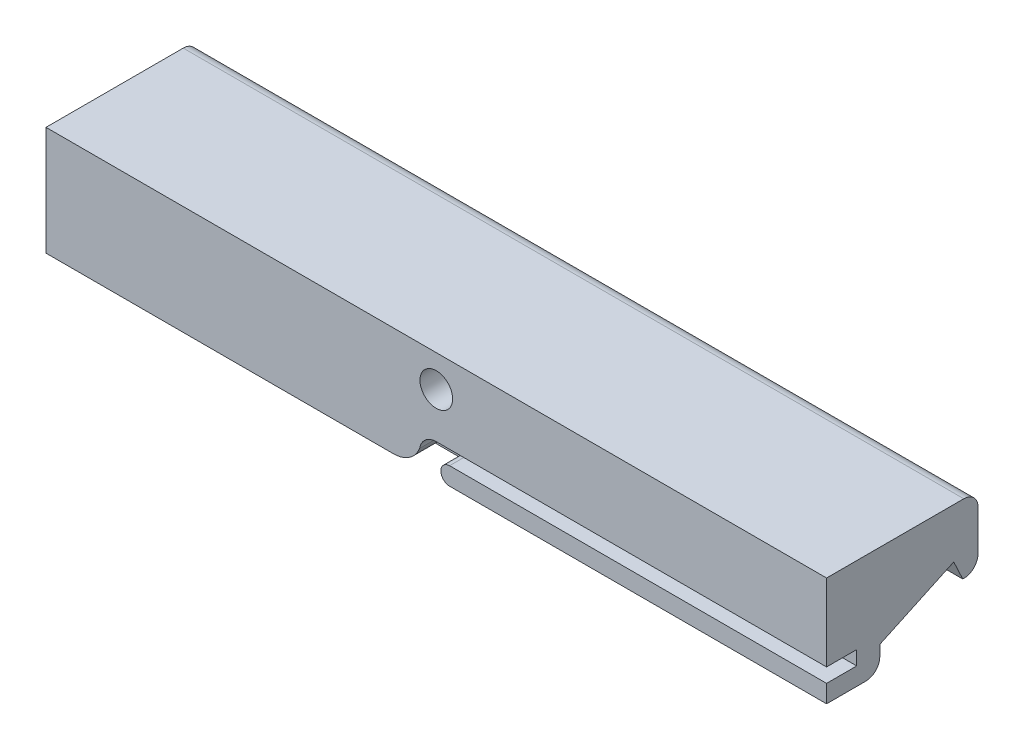
ISO-10303-21;
HEADER;
FILE_DESCRIPTION(('STEP AP214'),'2;1');
FILE_NAME('part.step','',(''),(''),'','','');
FILE_SCHEMA(('AUTOMOTIVE_DESIGN { 1 0 10303 214 1 1 1 1 }'));
ENDSEC;
DATA;
#1=APPLICATION_CONTEXT('core data for automotive mechanical design processes');
#2=APPLICATION_PROTOCOL_DEFINITION('international standard','automotive_design',2000,#1);
#3=PRODUCT_CONTEXT('',#1,'mechanical');
#4=PRODUCT('Part','Part','',(#3));
#5=PRODUCT_RELATED_PRODUCT_CATEGORY('part','',(#4));
#6=PRODUCT_DEFINITION_FORMATION('','',#4);
#7=PRODUCT_DEFINITION_CONTEXT('part definition',#1,'design');
#8=PRODUCT_DEFINITION('design','',#6,#7);
#9=PRODUCT_DEFINITION_SHAPE('','',#8);
#10=(LENGTH_UNIT() NAMED_UNIT(*) SI_UNIT(.MILLI.,.METRE.));
#11=(NAMED_UNIT(*) PLANE_ANGLE_UNIT() SI_UNIT($,.RADIAN.));
#12=(NAMED_UNIT(*) SI_UNIT($,.STERADIAN.) SOLID_ANGLE_UNIT());
#13=UNCERTAINTY_MEASURE_WITH_UNIT(LENGTH_MEASURE(1.E-05),#10,'distance_accuracy_value','');
#14=(GEOMETRIC_REPRESENTATION_CONTEXT(3) GLOBAL_UNCERTAINTY_ASSIGNED_CONTEXT((#13)) GLOBAL_UNIT_ASSIGNED_CONTEXT((#10,
#11,#12)) REPRESENTATION_CONTEXT('',''));
#15=CARTESIAN_POINT('',(0.,0.,0.));
#16=DIRECTION('',(0.,0.,1.));
#17=DIRECTION('',(1.,0.,0.));
#18=AXIS2_PLACEMENT_3D('',#15,#16,#17);
#19=CARTESIAN_POINT('',(110.,15.360110010018,0.));
#20=DIRECTION('',(0.,0.,-1.));
#21=DIRECTION('',(0.,1.,0.));
#22=AXIS2_PLACEMENT_3D('',#19,#20,#21);
#23=PLANE('',#22);
#24=CARTESIAN_POINT('',(55.,10.860110010018,0.));
#25=DIRECTION('',(0.,0.,1.));
#26=DIRECTION('',(1.,0.,0.));
#27=AXIS2_PLACEMENT_3D('',#24,#25,#26);
#28=CIRCLE('',#27,2.3);
#29=CARTESIAN_POINT('',(57.3,10.860110010018,0.));
#30=VERTEX_POINT('',#29);
#31=EDGE_CURVE('E252',#30,#30,#28,.T.);
#32=ORIENTED_EDGE('',*,*,#31,.F.);
#33=EDGE_LOOP('',(#32));
#34=FACE_BOUND('',#33,.T.);
#35=DIRECTION('',(-1.,0.,0.));
#36=VECTOR('',#35,1.);
#37=CARTESIAN_POINT('',(110.,0.,0.));
#38=LINE('',#37,#36);
#39=CARTESIAN_POINT('',(48.9895272834572,0.,0.));
#40=VERTEX_POINT('',#39);
#41=CARTESIAN_POINT('',(0.,0.,0.));
#42=VERTEX_POINT('',#41);
#43=EDGE_CURVE('E47',#40,#42,#38,.T.);
#44=ORIENTED_EDGE('',*,*,#43,.F.);
#45=CARTESIAN_POINT('',(48.9895272834572,3.93471053605362,0.));
#46=DIRECTION('',(0.,0.,-1.));
#47=DIRECTION('',(1.,0.,0.));
#48=AXIS2_PLACEMENT_3D('',#45,#46,#47);
#49=CIRCLE('',#48,3.93471053605362);
#50=CARTESIAN_POINT('',(52.6533439655892,2.5,0.));
#51=VERTEX_POINT('',#50);
#52=EDGE_CURVE('E289',#51,#40,#49,.T.);
#53=ORIENTED_EDGE('',*,*,#52,.F.);
#54=CARTESIAN_POINT('',(55.,2.12330136404079,0.));
#55=DIRECTION('',(0.,0.,1.));
#56=DIRECTION('',(-1.,0.,0.));
#57=AXIS2_PLACEMENT_3D('',#54,#55,#56);
#58=CIRCLE('',#57,2.37669863595921);
#59=CARTESIAN_POINT('',(55.,4.5,0.));
#60=VERTEX_POINT('',#59);
#61=EDGE_CURVE('E276',#60,#51,#58,.T.);
#62=ORIENTED_EDGE('',*,*,#61,.F.);
#63=DIRECTION('',(-1.,0.,0.));
#64=VECTOR('',#63,1.);
#65=CARTESIAN_POINT('',(55.,4.5,0.));
#66=LINE('',#65,#64);
#67=CARTESIAN_POINT('',(110.,4.5,0.));
#68=VERTEX_POINT('',#67);
#69=EDGE_CURVE('E280',#68,#60,#66,.T.);
#70=ORIENTED_EDGE('',*,*,#69,.F.);
#71=DIRECTION('',(0.,-1.,0.));
#72=VECTOR('',#71,1.);
#73=CARTESIAN_POINT('',(110.,15.360110010018,0.));
#74=LINE('',#73,#72);
#75=CARTESIAN_POINT('',(110.,15.360110010018,0.));
#76=VERTEX_POINT('',#75);
#77=EDGE_CURVE('E219',#76,#68,#74,.T.);
#78=ORIENTED_EDGE('',*,*,#77,.F.);
#79=DIRECTION('',(-1.,0.,0.));
#80=VECTOR('',#79,1.);
#81=CARTESIAN_POINT('',(110.,15.360110010018,0.));
#82=LINE('',#81,#80);
#83=CARTESIAN_POINT('',(0.,15.360110010018,0.));
#84=VERTEX_POINT('',#83);
#85=EDGE_CURVE('E158',#76,#84,#82,.T.);
#86=ORIENTED_EDGE('',*,*,#85,.T.);
#87=DIRECTION('',(0.,-1.,0.));
#88=VECTOR('',#87,1.);
#89=CARTESIAN_POINT('',(0.,15.360110010018,0.));
#90=LINE('',#89,#88);
#91=EDGE_CURVE('E162',#84,#42,#90,.T.);
#92=ORIENTED_EDGE('',*,*,#91,.T.);
#93=EDGE_LOOP('',(#44,#53,#62,#70,#78,#86,#92));
#94=FACE_BOUND('',#93,.T.);
#95=ADVANCED_FACE('F39',(#34,#94),#23,.F.);
#96=CARTESIAN_POINT('',(110.,0.,0.));
#97=DIRECTION('',(0.,1.,0.));
#98=DIRECTION('',(0.,0.,1.));
#99=AXIS2_PLACEMENT_3D('',#96,#97,#98);
#100=PLANE('',#99);
#101=DIRECTION('',(0.,0.,1.));
#102=VECTOR('',#101,1.);
#103=CARTESIAN_POINT('',(48.9895272834572,0.,-4.25));
#104=LINE('',#103,#102);
#105=CARTESIAN_POINT('',(48.9895272834572,0.,-4.25));
#106=VERTEX_POINT('',#105);
#107=EDGE_CURVE('E210',#106,#40,#104,.T.);
#108=ORIENTED_EDGE('',*,*,#107,.T.);
#109=ORIENTED_EDGE('',*,*,#43,.T.);
#110=DIRECTION('',(0.,0.,-1.));
#111=VECTOR('',#110,1.);
#112=CARTESIAN_POINT('',(0.,0.,0.));
#113=LINE('',#112,#111);
#114=CARTESIAN_POINT('',(0.,0.,-5.4994615533352));
#115=VERTEX_POINT('',#114);
#116=EDGE_CURVE('E165',#42,#115,#113,.T.);
#117=ORIENTED_EDGE('',*,*,#116,.T.);
#118=DIRECTION('',(-1.,0.,0.));
#119=VECTOR('',#118,1.);
#120=CARTESIAN_POINT('',(110.,0.,-5.4994615533352));
#121=LINE('',#120,#119);
#122=CARTESIAN_POINT('',(110.,0.,-5.4994615533352));
#123=VERTEX_POINT('',#122);
#124=EDGE_CURVE('E196',#123,#115,#121,.T.);
#125=ORIENTED_EDGE('',*,*,#124,.F.);
#126=DIRECTION('',(0.,0.,-1.));
#127=VECTOR('',#126,1.);
#128=CARTESIAN_POINT('',(110.,0.,0.));
#129=LINE('',#128,#127);
#130=CARTESIAN_POINT('',(110.,0.,0.));
#131=VERTEX_POINT('',#130);
#132=EDGE_CURVE('E244',#131,#123,#129,.T.);
#133=ORIENTED_EDGE('',*,*,#132,.F.);
#134=CARTESIAN_POINT('',(56.8728977846396,0.,0.));
#135=VERTEX_POINT('',#134);
#136=EDGE_CURVE('E11',#131,#135,#38,.T.);
#137=ORIENTED_EDGE('',*,*,#136,.T.);
#138=DIRECTION('',(0.,0.,1.));
#139=VECTOR('',#138,1.);
#140=CARTESIAN_POINT('',(56.8728977846396,0.,-4.25));
#141=LINE('',#140,#139);
#142=CARTESIAN_POINT('',(56.8728977846396,0.,-4.25));
#143=VERTEX_POINT('',#142);
#144=EDGE_CURVE('E259',#143,#135,#141,.T.);
#145=ORIENTED_EDGE('',*,*,#144,.F.);
#146=DIRECTION('',(1.,0.,0.));
#147=VECTOR('',#146,1.);
#148=CARTESIAN_POINT('',(48.9895272834572,0.,-4.25));
#149=LINE('',#148,#147);
#150=EDGE_CURVE('E302',#106,#143,#149,.T.);
#151=ORIENTED_EDGE('',*,*,#150,.F.);
#152=EDGE_LOOP('',(#108,#109,#117,#125,#133,#137,#145,#151));
#153=FACE_BOUND('',#152,.T.);
#154=ADVANCED_FACE('F206',(#153),#100,.F.);
#155=CARTESIAN_POINT('',(110.,2.5,0.));
#156=VERTEX_POINT('',#155);
#157=EDGE_CURVE('E110',#156,#131,#74,.T.);
#158=ORIENTED_EDGE('',*,*,#157,.F.);
#159=DIRECTION('',(1.,0.,0.));
#160=VECTOR('',#159,1.);
#161=CARTESIAN_POINT('',(56.8728977846396,2.5,0.));
#162=LINE('',#161,#160);
#163=CARTESIAN_POINT('',(56.8728977846396,2.5,0.));
#164=VERTEX_POINT('',#163);
#165=EDGE_CURVE('E283',#164,#156,#162,.T.);
#166=ORIENTED_EDGE('',*,*,#165,.F.);
#167=CARTESIAN_POINT('',(56.8928012546538,1.25,0.));
#168=DIRECTION('',(0.,0.,-1.));
#169=DIRECTION('',(1.,0.,0.));
#170=AXIS2_PLACEMENT_3D('',#167,#168,#169);
#171=CIRCLE('',#170,1.25015844920498);
#172=EDGE_CURVE('E286',#135,#164,#171,.T.);
#173=ORIENTED_EDGE('',*,*,#172,.F.);
#174=ORIENTED_EDGE('',*,*,#136,.F.);
#175=EDGE_LOOP('',(#158,#166,#173,#174));
#176=FACE_BOUND('',#175,.T.);
#177=ADVANCED_FACE('F41',(#176),#23,.F.);
#178=CARTESIAN_POINT('',(110.,2.0005384466648,-5.4994615533352));
#179=DIRECTION('',(-1.,0.,0.));
#180=DIRECTION('',(0.,0.,1.));
#181=AXIS2_PLACEMENT_3D('',#178,#179,#180);
#182=CYLINDRICAL_SURFACE('',#181,2.0005384466648);
#183=CARTESIAN_POINT('',(0.,2.0005384466648,-5.4994615533352));
#184=DIRECTION('',(1.,0.,0.));
#185=DIRECTION('',(0.,0.,-1.));
#186=AXIS2_PLACEMENT_3D('',#183,#184,#185);
#187=CIRCLE('',#186,2.0005384466648);
#188=CARTESIAN_POINT('',(0.,2.0005384466648,-7.5));
#189=VERTEX_POINT('',#188);
#190=EDGE_CURVE('E168',#115,#189,#187,.T.);
#191=ORIENTED_EDGE('',*,*,#190,.T.);
#192=DIRECTION('',(-1.,0.,0.));
#193=VECTOR('',#192,1.);
#194=CARTESIAN_POINT('',(110.,2.0005384466648,-7.5));
#195=LINE('',#194,#193);
#196=CARTESIAN_POINT('',(110.,2.0005384466648,-7.5));
#197=VERTEX_POINT('',#196);
#198=EDGE_CURVE('E194',#197,#189,#195,.T.);
#199=ORIENTED_EDGE('',*,*,#198,.F.);
#200=CARTESIAN_POINT('',(110.,2.0005384466648,-5.4994615533352));
#201=DIRECTION('',(1.,0.,0.));
#202=DIRECTION('',(0.,0.,-1.));
#203=AXIS2_PLACEMENT_3D('',#200,#201,#202);
#204=CIRCLE('',#203,2.0005384466648);
#205=EDGE_CURVE('E243',#123,#197,#204,.T.);
#206=ORIENTED_EDGE('',*,*,#205,.F.);
#207=ORIENTED_EDGE('',*,*,#124,.T.);
#208=EDGE_LOOP('',(#191,#199,#206,#207));
#209=FACE_BOUND('',#208,.T.);
#210=ADVANCED_FACE('F242',(#209),#182,.T.);
#211=CARTESIAN_POINT('',(110.,3.5,-7.5));
#212=DIRECTION('',(0.,0.,1.));
#213=DIRECTION('',(0.,-1.,0.));
#214=AXIS2_PLACEMENT_3D('',#211,#212,#213);
#215=PLANE('',#214);
#216=DIRECTION('',(0.,1.,0.));
#217=VECTOR('',#216,1.);
#218=CARTESIAN_POINT('',(0.,3.5,-7.5));
#219=LINE('',#218,#217);
#220=CARTESIAN_POINT('',(0.,3.5,-7.5));
#221=VERTEX_POINT('',#220);
#222=EDGE_CURVE('E170',#189,#221,#219,.T.);
#223=ORIENTED_EDGE('',*,*,#222,.T.);
#224=DIRECTION('',(-1.,0.,0.));
#225=VECTOR('',#224,1.);
#226=CARTESIAN_POINT('',(110.,3.5,-7.5));
#227=LINE('',#226,#225);
#228=CARTESIAN_POINT('',(110.,3.5,-7.5));
#229=VERTEX_POINT('',#228);
#230=EDGE_CURVE('E191',#229,#221,#227,.T.);
#231=ORIENTED_EDGE('',*,*,#230,.F.);
#232=DIRECTION('',(0.,1.,0.));
#233=VECTOR('',#232,1.);
#234=CARTESIAN_POINT('',(110.,3.5,-7.5));
#235=LINE('',#234,#233);
#236=EDGE_CURVE('E241',#197,#229,#235,.T.);
#237=ORIENTED_EDGE('',*,*,#236,.F.);
#238=ORIENTED_EDGE('',*,*,#198,.T.);
#239=EDGE_LOOP('',(#223,#231,#237,#238));
#240=FACE_BOUND('',#239,.T.);
#241=ADVANCED_FACE('F238',(#240),#215,.F.);
#242=CARTESIAN_POINT('',(110.,8.36011001001802,-17.9225395509215));
#243=DIRECTION('',(0.,0.906307787036651,0.422618261740697));
#244=DIRECTION('',(0.,-0.422618261740697,0.906307787036651));
#245=AXIS2_PLACEMENT_3D('',#242,#243,#244);
#246=PLANE('',#245);
#247=DIRECTION('',(0.,0.422618261740697,-0.906307787036651));
#248=VECTOR('',#247,1.);
#249=CARTESIAN_POINT('',(0.,8.36011001001802,-17.9225395509215));
#250=LINE('',#249,#248);
#251=CARTESIAN_POINT('',(0.,8.36011001001802,-17.9225395509215));
#252=VERTEX_POINT('',#251);
#253=EDGE_CURVE('E172',#221,#252,#250,.T.);
#254=ORIENTED_EDGE('',*,*,#253,.T.);
#255=DIRECTION('',(-1.,0.,0.));
#256=VECTOR('',#255,1.);
#257=CARTESIAN_POINT('',(110.,8.36011001001802,-17.9225395509215));
#258=LINE('',#257,#256);
#259=CARTESIAN_POINT('',(110.,8.36011001001802,-17.9225395509215));
#260=VERTEX_POINT('',#259);
#261=EDGE_CURVE('E188',#260,#252,#258,.T.);
#262=ORIENTED_EDGE('',*,*,#261,.F.);
#263=DIRECTION('',(0.,0.422618261740697,-0.906307787036651));
#264=VECTOR('',#263,1.);
#265=CARTESIAN_POINT('',(110.,8.36011001001802,-17.9225395509215));
#266=LINE('',#265,#264);
#267=EDGE_CURVE('E235',#229,#260,#266,.T.);
#268=ORIENTED_EDGE('',*,*,#267,.F.);
#269=ORIENTED_EDGE('',*,*,#230,.T.);
#270=EDGE_LOOP('',(#254,#262,#268,#269));
#271=FACE_BOUND('',#270,.T.);
#272=ADVANCED_FACE('F234',(#271),#246,.F.);
#273=CARTESIAN_POINT('',(110.,5.64118664890806,-19.1903943361436));
#274=DIRECTION('',(0.,0.422618261740697,-0.906307787036651));
#275=DIRECTION('',(0.,0.906307787036651,0.422618261740697));
#276=AXIS2_PLACEMENT_3D('',#273,#274,#275);
#277=PLANE('',#276);
#278=DIRECTION('',(0.,-0.906307787036651,-0.422618261740697));
#279=VECTOR('',#278,1.);
#280=CARTESIAN_POINT('',(0.,5.64118664890806,-19.1903943361436));
#281=LINE('',#280,#279);
#282=CARTESIAN_POINT('',(0.,5.64118664890806,-19.1903943361436));
#283=VERTEX_POINT('',#282);
#284=EDGE_CURVE('E174',#252,#283,#281,.T.);
#285=ORIENTED_EDGE('',*,*,#284,.T.);
#286=DIRECTION('',(-1.,0.,0.));
#287=VECTOR('',#286,1.);
#288=CARTESIAN_POINT('',(110.,5.64118664890806,-19.1903943361436));
#289=LINE('',#288,#287);
#290=CARTESIAN_POINT('',(110.,5.64118664890806,-19.1903943361436));
#291=VERTEX_POINT('',#290);
#292=EDGE_CURVE('E185',#291,#283,#289,.T.);
#293=ORIENTED_EDGE('',*,*,#292,.F.);
#294=DIRECTION('',(0.,-0.906307787036651,-0.422618261740697));
#295=VECTOR('',#294,1.);
#296=CARTESIAN_POINT('',(110.,5.64118664890806,-19.1903943361436));
#297=LINE('',#296,#295);
#298=EDGE_CURVE('E230',#260,#291,#297,.T.);
#299=ORIENTED_EDGE('',*,*,#298,.F.);
#300=ORIENTED_EDGE('',*,*,#261,.T.);
#301=EDGE_LOOP('',(#285,#293,#299,#300));
#302=FACE_BOUND('',#301,.T.);
#303=ADVANCED_FACE('F229',(#302),#277,.F.);
#304=CARTESIAN_POINT('',(110.,7.63552847711335,-19.3407295358501));
#305=DIRECTION('',(-1.,0.,0.));
#306=DIRECTION('',(0.,0.,1.));
#307=AXIS2_PLACEMENT_3D('',#304,#305,#306);
#308=CYLINDRICAL_SURFACE('',#307,2.);
#309=CARTESIAN_POINT('',(0.,7.63552847711335,-19.3407295358501));
#310=DIRECTION('',(1.,0.,0.));
#311=DIRECTION('',(0.,0.,-1.));
#312=AXIS2_PLACEMENT_3D('',#309,#310,#311);
#313=CIRCLE('',#312,2.);
#314=CARTESIAN_POINT('',(0.,7.63552847711335,-21.3407295358501));
#315=VERTEX_POINT('',#314);
#316=EDGE_CURVE('E176',#283,#315,#313,.T.);
#317=ORIENTED_EDGE('',*,*,#316,.T.);
#318=DIRECTION('',(-1.,0.,0.));
#319=VECTOR('',#318,1.);
#320=CARTESIAN_POINT('',(110.,7.63552847711335,-21.3407295358501));
#321=LINE('',#320,#319);
#322=CARTESIAN_POINT('',(110.,7.63552847711335,-21.3407295358501));
#323=VERTEX_POINT('',#322);
#324=EDGE_CURVE('E153',#323,#315,#321,.T.);
#325=ORIENTED_EDGE('',*,*,#324,.F.);
#326=CARTESIAN_POINT('',(110.,7.63552847711335,-19.3407295358501));
#327=DIRECTION('',(1.,0.,0.));
#328=DIRECTION('',(0.,0.,-1.));
#329=AXIS2_PLACEMENT_3D('',#326,#327,#328);
#330=CIRCLE('',#329,2.);
#331=EDGE_CURVE('E141',#291,#323,#330,.T.);
#332=ORIENTED_EDGE('',*,*,#331,.F.);
#333=ORIENTED_EDGE('',*,*,#292,.T.);
#334=EDGE_LOOP('',(#317,#325,#332,#333));
#335=FACE_BOUND('',#334,.T.);
#336=ADVANCED_FACE('F225',(#335),#308,.T.);
#337=CARTESIAN_POINT('',(110.,7.63552847711335,-21.3407295358501));
#338=DIRECTION('',(0.,0.,1.));
#339=DIRECTION('',(1.,0.,0.));
#340=AXIS2_PLACEMENT_3D('',#337,#338,#339);
#341=PLANE('',#340);
#342=DIRECTION('',(0.,1.,0.));
#343=VECTOR('',#342,1.);
#344=CARTESIAN_POINT('',(0.,7.63552847711335,-21.3407295358501));
#345=LINE('',#344,#343);
#346=CARTESIAN_POINT('',(0.,13.360110010018,-21.3407295358501));
#347=VERTEX_POINT('',#346);
#348=EDGE_CURVE('E150',#315,#347,#345,.T.);
#349=ORIENTED_EDGE('',*,*,#348,.T.);
#350=DIRECTION('',(-1.,0.,0.));
#351=VECTOR('',#350,1.);
#352=CARTESIAN_POINT('',(110.,13.360110010018,-21.3407295358501));
#353=LINE('',#352,#351);
#354=CARTESIAN_POINT('',(110.,13.360110010018,-21.3407295358501));
#355=VERTEX_POINT('',#354);
#356=EDGE_CURVE('E147',#355,#347,#353,.T.);
#357=ORIENTED_EDGE('',*,*,#356,.F.);
#358=DIRECTION('',(0.,1.,0.));
#359=VECTOR('',#358,1.);
#360=CARTESIAN_POINT('',(110.,7.63552847711335,-21.3407295358501));
#361=LINE('',#360,#359);
#362=EDGE_CURVE('E133',#323,#355,#361,.T.);
#363=ORIENTED_EDGE('',*,*,#362,.F.);
#364=ORIENTED_EDGE('',*,*,#324,.T.);
#365=EDGE_LOOP('',(#349,#357,#363,#364));
#366=FACE_BOUND('',#365,.T.);
#367=ADVANCED_FACE('F148',(#366),#341,.F.);
#368=CARTESIAN_POINT('',(110.,13.360110010018,-19.3407295358501));
#369=DIRECTION('',(-1.,0.,0.));
#370=DIRECTION('',(0.,0.,1.));
#371=AXIS2_PLACEMENT_3D('',#368,#369,#370);
#372=CYLINDRICAL_SURFACE('',#371,2.);
#373=CARTESIAN_POINT('',(0.,13.360110010018,-19.3407295358501));
#374=DIRECTION('',(1.,0.,0.));
#375=DIRECTION('',(0.,0.,1.));
#376=AXIS2_PLACEMENT_3D('',#373,#374,#375);
#377=CIRCLE('',#376,2.);
#378=CARTESIAN_POINT('',(0.,15.360110010018,-19.3407295358501));
#379=VERTEX_POINT('',#378);
#380=EDGE_CURVE('E179',#347,#379,#377,.T.);
#381=ORIENTED_EDGE('',*,*,#380,.T.);
#382=DIRECTION('',(-1.,0.,0.));
#383=VECTOR('',#382,1.);
#384=CARTESIAN_POINT('',(110.,15.360110010018,-19.3407295358501));
#385=LINE('',#384,#383);
#386=CARTESIAN_POINT('',(110.,15.360110010018,-19.3407295358501));
#387=VERTEX_POINT('',#386);
#388=EDGE_CURVE('E154',#387,#379,#385,.T.);
#389=ORIENTED_EDGE('',*,*,#388,.F.);
#390=CARTESIAN_POINT('',(110.,13.360110010018,-19.3407295358501));
#391=DIRECTION('',(1.,0.,0.));
#392=DIRECTION('',(0.,0.,1.));
#393=AXIS2_PLACEMENT_3D('',#390,#391,#392);
#394=CIRCLE('',#393,2.);
#395=EDGE_CURVE('E138',#355,#387,#394,.T.);
#396=ORIENTED_EDGE('',*,*,#395,.F.);
#397=ORIENTED_EDGE('',*,*,#356,.T.);
#398=EDGE_LOOP('',(#381,#389,#396,#397));
#399=FACE_BOUND('',#398,.T.);
#400=ADVANCED_FACE('F156',(#399),#372,.T.);
#401=CARTESIAN_POINT('',(110.,15.360110010018,-19.3407295358501));
#402=DIRECTION('',(0.,-1.,0.));
#403=DIRECTION('',(0.,0.,-1.));
#404=AXIS2_PLACEMENT_3D('',#401,#402,#403);
#405=PLANE('',#404);
#406=DIRECTION('',(0.,0.,1.));
#407=VECTOR('',#406,1.);
#408=CARTESIAN_POINT('',(0.,15.360110010018,-19.3407295358501));
#409=LINE('',#408,#407);
#410=EDGE_CURVE('E102',#379,#84,#409,.T.);
#411=ORIENTED_EDGE('',*,*,#410,.T.);
#412=ORIENTED_EDGE('',*,*,#85,.F.);
#413=DIRECTION('',(0.,0.,1.));
#414=VECTOR('',#413,1.);
#415=CARTESIAN_POINT('',(110.,15.360110010018,-19.3407295358501));
#416=LINE('',#415,#414);
#417=EDGE_CURVE('E63',#387,#76,#416,.T.);
#418=ORIENTED_EDGE('',*,*,#417,.F.);
#419=ORIENTED_EDGE('',*,*,#388,.T.);
#420=EDGE_LOOP('',(#411,#412,#418,#419));
#421=FACE_BOUND('',#420,.T.);
#422=ADVANCED_FACE('F220',(#421),#405,.F.);
#423=CARTESIAN_POINT('',(110.,2.0005384466648,-5.4994615533352));
#424=DIRECTION('',(1.,0.,0.));
#425=DIRECTION('',(0.,0.,-1.));
#426=AXIS2_PLACEMENT_3D('',#423,#424,#425);
#427=PLANE('',#426);
#428=DIRECTION('',(0.,0.,1.));
#429=VECTOR('',#428,1.);
#430=CARTESIAN_POINT('',(110.,4.5,-4.25));
#431=LINE('',#430,#429);
#432=CARTESIAN_POINT('',(110.,4.5,-4.25));
#433=VERTEX_POINT('',#432);
#434=EDGE_CURVE('E268',#433,#68,#431,.T.);
#435=ORIENTED_EDGE('',*,*,#434,.F.);
#436=DIRECTION('',(0.,1.,0.));
#437=VECTOR('',#436,1.);
#438=CARTESIAN_POINT('',(110.,4.5,-4.25));
#439=LINE('',#438,#437);
#440=CARTESIAN_POINT('',(110.,2.5,-4.25));
#441=VERTEX_POINT('',#440);
#442=EDGE_CURVE('E297',#441,#433,#439,.T.);
#443=ORIENTED_EDGE('',*,*,#442,.F.);
#444=DIRECTION('',(0.,0.,1.));
#445=VECTOR('',#444,1.);
#446=CARTESIAN_POINT('',(110.,2.5,-4.25));
#447=LINE('',#446,#445);
#448=EDGE_CURVE('E266',#441,#156,#447,.T.);
#449=ORIENTED_EDGE('',*,*,#448,.T.);
#450=ORIENTED_EDGE('',*,*,#157,.T.);
#451=ORIENTED_EDGE('',*,*,#132,.T.);
#452=ORIENTED_EDGE('',*,*,#205,.T.);
#453=ORIENTED_EDGE('',*,*,#236,.T.);
#454=ORIENTED_EDGE('',*,*,#267,.T.);
#455=ORIENTED_EDGE('',*,*,#298,.T.);
#456=ORIENTED_EDGE('',*,*,#331,.T.);
#457=ORIENTED_EDGE('',*,*,#362,.T.);
#458=ORIENTED_EDGE('',*,*,#395,.T.);
#459=ORIENTED_EDGE('',*,*,#417,.T.);
#460=ORIENTED_EDGE('',*,*,#77,.T.);
#461=EDGE_LOOP('',(#435,#443,#449,#450,#451,#452,#453,#454,#455,#456,#457,#458,#459,#460));
#462=FACE_BOUND('',#461,.T.);
#463=ADVANCED_FACE('F136',(#462),#427,.T.);
#464=CARTESIAN_POINT('',(0.,2.0005384466648,-5.4994615533352));
#465=DIRECTION('',(1.,0.,0.));
#466=DIRECTION('',(0.,0.,-1.));
#467=AXIS2_PLACEMENT_3D('',#464,#465,#466);
#468=PLANE('',#467);
#469=ORIENTED_EDGE('',*,*,#91,.F.);
#470=ORIENTED_EDGE('',*,*,#410,.F.);
#471=ORIENTED_EDGE('',*,*,#380,.F.);
#472=ORIENTED_EDGE('',*,*,#348,.F.);
#473=ORIENTED_EDGE('',*,*,#316,.F.);
#474=ORIENTED_EDGE('',*,*,#284,.F.);
#475=ORIENTED_EDGE('',*,*,#253,.F.);
#476=ORIENTED_EDGE('',*,*,#222,.F.);
#477=ORIENTED_EDGE('',*,*,#190,.F.);
#478=ORIENTED_EDGE('',*,*,#116,.F.);
#479=EDGE_LOOP('',(#469,#470,#471,#472,#473,#474,#475,#476,#477,#478));
#480=FACE_BOUND('',#479,.T.);
#481=ADVANCED_FACE('F215',(#480),#468,.F.);
#482=CARTESIAN_POINT('',(55.,10.860110010018,-4.5));
#483=DIRECTION('',(0.,0.,1.));
#484=DIRECTION('',(1.,0.,0.));
#485=AXIS2_PLACEMENT_3D('',#482,#483,#484);
#486=CYLINDRICAL_SURFACE('',#485,2.3);
#487=CARTESIAN_POINT('',(55.,10.860110010018,-4.5));
#488=DIRECTION('',(0.,0.,1.));
#489=DIRECTION('',(1.,0.,0.));
#490=AXIS2_PLACEMENT_3D('',#487,#488,#489);
#491=CIRCLE('',#490,2.3);
#492=CARTESIAN_POINT('',(57.3,10.860110010018,-4.5));
#493=VERTEX_POINT('',#492);
#494=EDGE_CURVE('E166',#493,#493,#491,.T.);
#495=ORIENTED_EDGE('',*,*,#494,.F.);
#496=EDGE_LOOP('',(#495));
#497=FACE_BOUND('',#496,.T.);
#498=ORIENTED_EDGE('',*,*,#31,.T.);
#499=EDGE_LOOP('',(#498));
#500=FACE_BOUND('',#499,.T.);
#501=ADVANCED_FACE('F392',(#497,#500),#486,.F.);
#502=CARTESIAN_POINT('',(55.,10.860110010018,-4.5));
#503=DIRECTION('',(0.,0.,1.));
#504=DIRECTION('',(1.,0.,0.));
#505=AXIS2_PLACEMENT_3D('',#502,#503,#504);
#506=PLANE('',#505);
#507=ORIENTED_EDGE('',*,*,#494,.T.);
#508=EDGE_LOOP('',(#507));
#509=FACE_BOUND('',#508,.T.);
#510=ADVANCED_FACE('F396',(#509),#506,.T.);
#511=CARTESIAN_POINT('',(48.9895272834572,3.93471053605362,-4.25));
#512=DIRECTION('',(0.,0.,1.));
#513=DIRECTION('',(1.,0.,0.));
#514=AXIS2_PLACEMENT_3D('',#511,#512,#513);
#515=CYLINDRICAL_SURFACE('',#514,3.93471053605362);
#516=ORIENTED_EDGE('',*,*,#52,.T.);
#517=ORIENTED_EDGE('',*,*,#107,.F.);
#518=CARTESIAN_POINT('',(48.9895272834572,3.93471053605362,-4.25));
#519=DIRECTION('',(0.,0.,-1.));
#520=DIRECTION('',(1.,0.,0.));
#521=AXIS2_PLACEMENT_3D('',#518,#519,#520);
#522=CIRCLE('',#521,3.93471053605362);
#523=CARTESIAN_POINT('',(52.6533439655892,2.5,-4.25));
#524=VERTEX_POINT('',#523);
#525=EDGE_CURVE('E279',#524,#106,#522,.T.);
#526=ORIENTED_EDGE('',*,*,#525,.F.);
#527=DIRECTION('',(0.,0.,1.));
#528=VECTOR('',#527,1.);
#529=CARTESIAN_POINT('',(52.6533439655892,2.5,-4.25));
#530=LINE('',#529,#528);
#531=EDGE_CURVE('E255',#524,#51,#530,.T.);
#532=ORIENTED_EDGE('',*,*,#531,.T.);
#533=EDGE_LOOP('',(#516,#517,#526,#532));
#534=FACE_BOUND('',#533,.T.);
#535=ADVANCED_FACE('F348',(#534),#515,.T.);
#536=CARTESIAN_POINT('',(55.,2.12330136404079,-4.25));
#537=DIRECTION('',(0.,0.,1.));
#538=DIRECTION('',(1.,0.,0.));
#539=AXIS2_PLACEMENT_3D('',#536,#537,#538);
#540=CYLINDRICAL_SURFACE('',#539,2.37669863595921);
#541=ORIENTED_EDGE('',*,*,#61,.T.);
#542=ORIENTED_EDGE('',*,*,#531,.F.);
#543=CARTESIAN_POINT('',(55.,2.12330136404079,-4.25));
#544=DIRECTION('',(0.,0.,1.));
#545=DIRECTION('',(-1.,0.,0.));
#546=AXIS2_PLACEMENT_3D('',#543,#544,#545);
#547=CIRCLE('',#546,2.37669863595921);
#548=CARTESIAN_POINT('',(55.,4.5,-4.25));
#549=VERTEX_POINT('',#548);
#550=EDGE_CURVE('E260',#549,#524,#547,.T.);
#551=ORIENTED_EDGE('',*,*,#550,.F.);
#552=DIRECTION('',(0.,0.,1.));
#553=VECTOR('',#552,1.);
#554=CARTESIAN_POINT('',(55.,4.5,-4.25));
#555=LINE('',#554,#553);
#556=EDGE_CURVE('E271',#549,#60,#555,.T.);
#557=ORIENTED_EDGE('',*,*,#556,.T.);
#558=EDGE_LOOP('',(#541,#542,#551,#557));
#559=FACE_BOUND('',#558,.T.);
#560=ADVANCED_FACE('F350',(#559),#540,.F.);
#561=CARTESIAN_POINT('',(55.,4.5,-4.25));
#562=DIRECTION('',(0.,1.,0.));
#563=DIRECTION('',(0.,0.,1.));
#564=AXIS2_PLACEMENT_3D('',#561,#562,#563);
#565=PLANE('',#564);
#566=ORIENTED_EDGE('',*,*,#69,.T.);
#567=ORIENTED_EDGE('',*,*,#556,.F.);
#568=DIRECTION('',(-1.,0.,0.));
#569=VECTOR('',#568,1.);
#570=CARTESIAN_POINT('',(55.,4.5,-4.25));
#571=LINE('',#570,#569);
#572=EDGE_CURVE('E294',#433,#549,#571,.T.);
#573=ORIENTED_EDGE('',*,*,#572,.F.);
#574=ORIENTED_EDGE('',*,*,#434,.T.);
#575=EDGE_LOOP('',(#566,#567,#573,#574));
#576=FACE_BOUND('',#575,.T.);
#577=ADVANCED_FACE('F351',(#576),#565,.F.);
#578=CARTESIAN_POINT('',(56.8728977846396,2.5,-4.25));
#579=DIRECTION('',(0.,-1.,0.));
#580=DIRECTION('',(0.,0.,-1.));
#581=AXIS2_PLACEMENT_3D('',#578,#579,#580);
#582=PLANE('',#581);
#583=ORIENTED_EDGE('',*,*,#165,.T.);
#584=ORIENTED_EDGE('',*,*,#448,.F.);
#585=DIRECTION('',(1.,0.,0.));
#586=VECTOR('',#585,1.);
#587=CARTESIAN_POINT('',(56.8728977846396,2.5,-4.25));
#588=LINE('',#587,#586);
#589=CARTESIAN_POINT('',(56.8728977846396,2.5,-4.25));
#590=VERTEX_POINT('',#589);
#591=EDGE_CURVE('E54',#590,#441,#588,.T.);
#592=ORIENTED_EDGE('',*,*,#591,.F.);
#593=DIRECTION('',(0.,0.,1.));
#594=VECTOR('',#593,1.);
#595=CARTESIAN_POINT('',(56.8728977846396,2.5,-4.25));
#596=LINE('',#595,#594);
#597=EDGE_CURVE('E263',#590,#164,#596,.T.);
#598=ORIENTED_EDGE('',*,*,#597,.T.);
#599=EDGE_LOOP('',(#583,#584,#592,#598));
#600=FACE_BOUND('',#599,.T.);
#601=ADVANCED_FACE('F330',(#600),#582,.F.);
#602=CARTESIAN_POINT('',(56.8928012546538,1.25,-4.25));
#603=DIRECTION('',(0.,0.,1.));
#604=DIRECTION('',(1.,0.,0.));
#605=AXIS2_PLACEMENT_3D('',#602,#603,#604);
#606=CYLINDRICAL_SURFACE('',#605,1.25015844920498);
#607=ORIENTED_EDGE('',*,*,#172,.T.);
#608=ORIENTED_EDGE('',*,*,#597,.F.);
#609=CARTESIAN_POINT('',(56.8928012546538,1.25,-4.25));
#610=DIRECTION('',(0.,0.,-1.));
#611=DIRECTION('',(1.,0.,0.));
#612=AXIS2_PLACEMENT_3D('',#609,#610,#611);
#613=CIRCLE('',#612,1.25015844920498);
#614=EDGE_CURVE('E300',#143,#590,#613,.T.);
#615=ORIENTED_EDGE('',*,*,#614,.F.);
#616=ORIENTED_EDGE('',*,*,#144,.T.);
#617=EDGE_LOOP('',(#607,#608,#615,#616));
#618=FACE_BOUND('',#617,.T.);
#619=ADVANCED_FACE('F321',(#618),#606,.T.);
#620=CARTESIAN_POINT('',(48.9895272834572,3.93471053605362,-4.25));
#621=DIRECTION('',(0.,0.,1.));
#622=DIRECTION('',(1.,0.,0.));
#623=AXIS2_PLACEMENT_3D('',#620,#621,#622);
#624=PLANE('',#623);
#625=ORIENTED_EDGE('',*,*,#525,.T.);
#626=ORIENTED_EDGE('',*,*,#150,.T.);
#627=ORIENTED_EDGE('',*,*,#614,.T.);
#628=ORIENTED_EDGE('',*,*,#591,.T.);
#629=ORIENTED_EDGE('',*,*,#442,.T.);
#630=ORIENTED_EDGE('',*,*,#572,.T.);
#631=ORIENTED_EDGE('',*,*,#550,.T.);
#632=EDGE_LOOP('',(#625,#626,#627,#628,#629,#630,#631));
#633=FACE_BOUND('',#632,.T.);
#634=ADVANCED_FACE('F308',(#633),#624,.T.);
#635=CLOSED_SHELL('',(#95,#154,#177,#210,#241,#272,#303,#336,#367,#400,#422,#463,#481,#501,#510,
#535,#560,#577,#601,#619,#634));
#636=MANIFOLD_SOLID_BREP('B2',#635);
#637=ADVANCED_BREP_SHAPE_REPRESENTATION('',(#18,#636),#14);
#638=SHAPE_DEFINITION_REPRESENTATION(#9,#637);
ENDSEC;
END-ISO-10303-21;
